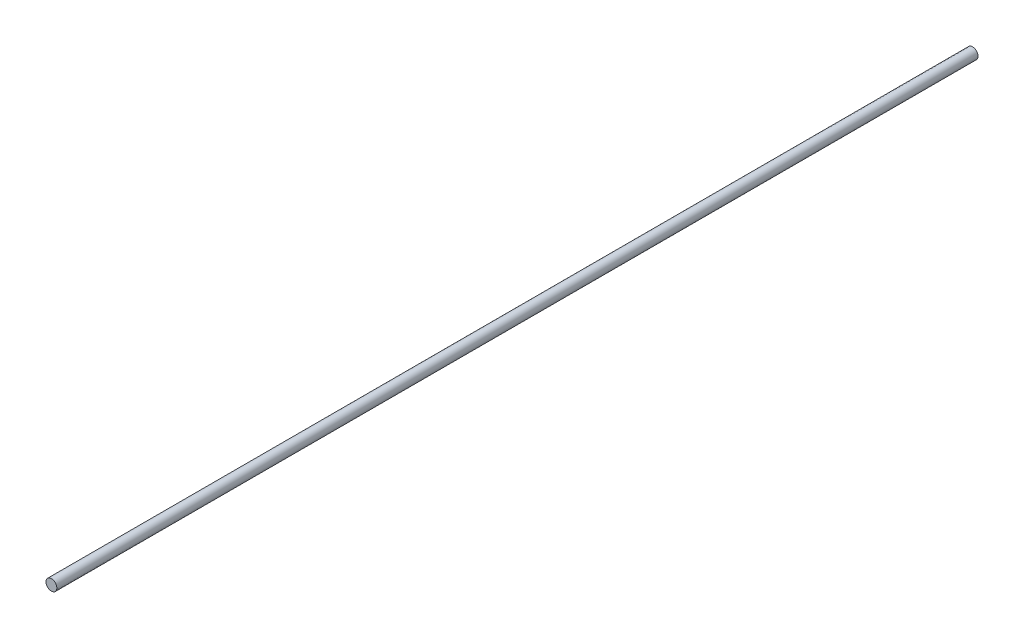
ISO-10303-21;
HEADER;
FILE_DESCRIPTION(('STEP AP214'),'2;1');
FILE_NAME('part.step','',(''),(''),'','','');
FILE_SCHEMA(('AUTOMOTIVE_DESIGN { 1 0 10303 214 1 1 1 1 }'));
ENDSEC;
DATA;
#1=APPLICATION_CONTEXT('core data for automotive mechanical design processes');
#2=APPLICATION_PROTOCOL_DEFINITION('international standard','automotive_design',2000,#1);
#3=PRODUCT_CONTEXT('',#1,'mechanical');
#4=PRODUCT('Part','Part','',(#3));
#5=PRODUCT_RELATED_PRODUCT_CATEGORY('part','',(#4));
#6=PRODUCT_DEFINITION_FORMATION('','',#4);
#7=PRODUCT_DEFINITION_CONTEXT('part definition',#1,'design');
#8=PRODUCT_DEFINITION('design','',#6,#7);
#9=PRODUCT_DEFINITION_SHAPE('','',#8);
#10=(LENGTH_UNIT() NAMED_UNIT(*) SI_UNIT(.MILLI.,.METRE.));
#11=(NAMED_UNIT(*) PLANE_ANGLE_UNIT() SI_UNIT($,.RADIAN.));
#12=(NAMED_UNIT(*) SI_UNIT($,.STERADIAN.) SOLID_ANGLE_UNIT());
#13=UNCERTAINTY_MEASURE_WITH_UNIT(LENGTH_MEASURE(1.E-05),#10,'distance_accuracy_value','');
#14=(GEOMETRIC_REPRESENTATION_CONTEXT(3) GLOBAL_UNCERTAINTY_ASSIGNED_CONTEXT((#13)) GLOBAL_UNIT_ASSIGNED_CONTEXT((#10,
#11,#12)) REPRESENTATION_CONTEXT('',''));
#15=CARTESIAN_POINT('',(0.,0.,0.));
#16=DIRECTION('',(0.,0.,1.));
#17=DIRECTION('',(1.,0.,0.));
#18=AXIS2_PLACEMENT_3D('',#15,#16,#17);
#19=CARTESIAN_POINT('',(28.0957094391455,18.9504617357995,3390.));
#20=DIRECTION('',(0.,0.,-1.));
#21=DIRECTION('',(-1.,0.,0.));
#22=AXIS2_PLACEMENT_3D('',#19,#20,#21);
#23=CYLINDRICAL_SURFACE('',#22,20.);
#24=CARTESIAN_POINT('',(28.0957094391455,18.9504617357995,3390.));
#25=DIRECTION('',(0.,0.,1.));
#26=DIRECTION('',(1.,0.,0.));
#27=AXIS2_PLACEMENT_3D('',#24,#25,#26);
#28=CIRCLE('',#27,20.);
#29=CARTESIAN_POINT('',(48.0957094391455,18.9504617357995,3390.));
#30=VERTEX_POINT('',#29);
#31=EDGE_CURVE('E10',#30,#30,#28,.T.);
#32=ORIENTED_EDGE('',*,*,#31,.F.);
#33=EDGE_LOOP('',(#32));
#34=FACE_BOUND('',#33,.T.);
#35=CARTESIAN_POINT('',(28.0957094391455,18.9504617357995,0.));
#36=DIRECTION('',(0.,0.,1.));
#37=DIRECTION('',(1.,0.,0.));
#38=AXIS2_PLACEMENT_3D('',#35,#36,#37);
#39=CIRCLE('',#38,20.);
#40=CARTESIAN_POINT('',(48.0957094391455,18.9504617357995,0.));
#41=VERTEX_POINT('',#40);
#42=EDGE_CURVE('E38',#41,#41,#39,.T.);
#43=ORIENTED_EDGE('',*,*,#42,.T.);
#44=EDGE_LOOP('',(#43));
#45=FACE_BOUND('',#44,.T.);
#46=ADVANCED_FACE('F35',(#34,#45),#23,.T.);
#47=CARTESIAN_POINT('',(28.0957094391455,18.9504617357995,3390.));
#48=DIRECTION('',(0.,0.,1.));
#49=DIRECTION('',(1.,0.,0.));
#50=AXIS2_PLACEMENT_3D('',#47,#48,#49);
#51=PLANE('',#50);
#52=ORIENTED_EDGE('',*,*,#31,.T.);
#53=EDGE_LOOP('',(#52));
#54=FACE_BOUND('',#53,.T.);
#55=ADVANCED_FACE('F50',(#54),#51,.T.);
#56=CARTESIAN_POINT('',(28.0957094391455,18.9504617357995,0.));
#57=DIRECTION('',(0.,0.,1.));
#58=DIRECTION('',(1.,0.,0.));
#59=AXIS2_PLACEMENT_3D('',#56,#57,#58);
#60=PLANE('',#59);
#61=ORIENTED_EDGE('',*,*,#42,.F.);
#62=EDGE_LOOP('',(#61));
#63=FACE_BOUND('',#62,.T.);
#64=ADVANCED_FACE('F48',(#63),#60,.F.);
#65=CLOSED_SHELL('',(#46,#55,#64));
#66=MANIFOLD_SOLID_BREP('B2',#65);
#67=ADVANCED_BREP_SHAPE_REPRESENTATION('',(#18,#66),#14);
#68=SHAPE_DEFINITION_REPRESENTATION(#9,#67);
ENDSEC;
END-ISO-10303-21;
